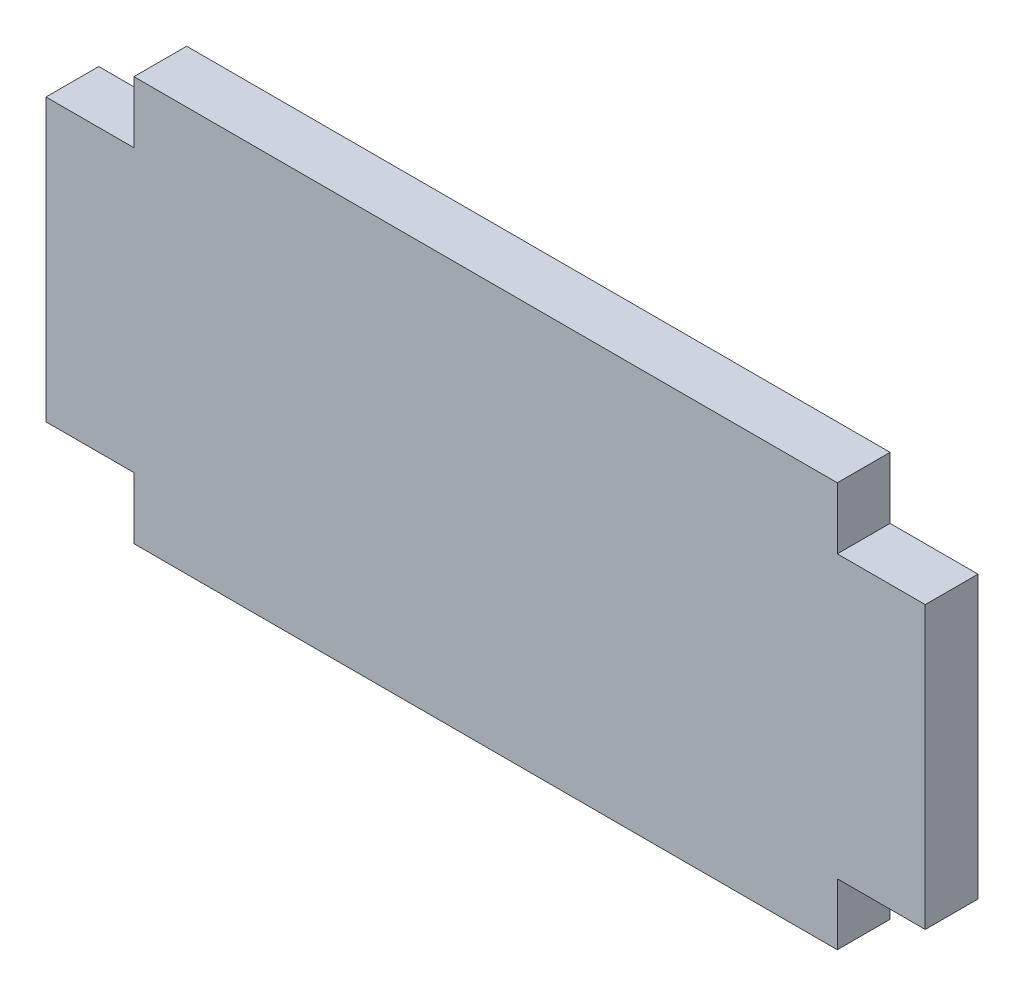
ISO-10303-21;
HEADER;
FILE_DESCRIPTION(('STEP AP214'),'2;1');
FILE_NAME('part.step','',(''),(''),'','','');
FILE_SCHEMA(('AUTOMOTIVE_DESIGN { 1 0 10303 214 1 1 1 1 }'));
ENDSEC;
DATA;
#1=APPLICATION_CONTEXT('core data for automotive mechanical design processes');
#2=APPLICATION_PROTOCOL_DEFINITION('international standard','automotive_design',2000,#1);
#3=PRODUCT_CONTEXT('',#1,'mechanical');
#4=PRODUCT('Part','Part','',(#3));
#5=PRODUCT_RELATED_PRODUCT_CATEGORY('part','',(#4));
#6=PRODUCT_DEFINITION_FORMATION('','',#4);
#7=PRODUCT_DEFINITION_CONTEXT('part definition',#1,'design');
#8=PRODUCT_DEFINITION('design','',#6,#7);
#9=PRODUCT_DEFINITION_SHAPE('','',#8);
#10=(LENGTH_UNIT() NAMED_UNIT(*) SI_UNIT(.MILLI.,.METRE.));
#11=(NAMED_UNIT(*) PLANE_ANGLE_UNIT() SI_UNIT($,.RADIAN.));
#12=(NAMED_UNIT(*) SI_UNIT($,.STERADIAN.) SOLID_ANGLE_UNIT());
#13=UNCERTAINTY_MEASURE_WITH_UNIT(LENGTH_MEASURE(1.E-05),#10,'distance_accuracy_value','');
#14=(GEOMETRIC_REPRESENTATION_CONTEXT(3) GLOBAL_UNCERTAINTY_ASSIGNED_CONTEXT((#13)) GLOBAL_UNIT_ASSIGNED_CONTEXT((#10,
#11,#12)) REPRESENTATION_CONTEXT('',''));
#15=CARTESIAN_POINT('',(0.,0.,0.));
#16=DIRECTION('',(0.,0.,1.));
#17=DIRECTION('',(1.,0.,0.));
#18=AXIS2_PLACEMENT_3D('',#15,#16,#17);
#19=CARTESIAN_POINT('',(-4.,-16.,6.));
#20=DIRECTION('',(0.,1.,0.));
#21=DIRECTION('',(0.,0.,1.));
#22=AXIS2_PLACEMENT_3D('',#19,#20,#21);
#23=PLANE('',#22);
#24=DIRECTION('',(1.,0.,0.));
#25=VECTOR('',#24,1.);
#26=CARTESIAN_POINT('',(-4.,-16.,0.));
#27=LINE('',#26,#25);
#28=CARTESIAN_POINT('',(-4.,-16.,0.));
#29=VERTEX_POINT('',#28);
#30=CARTESIAN_POINT('',(6.,-16.,0.));
#31=VERTEX_POINT('',#30);
#32=EDGE_CURVE('E153',#29,#31,#27,.T.);
#33=ORIENTED_EDGE('',*,*,#32,.T.);
#34=DIRECTION('',(0.,0.,-1.));
#35=VECTOR('',#34,1.);
#36=CARTESIAN_POINT('',(6.,-16.,6.));
#37=LINE('',#36,#35);
#38=CARTESIAN_POINT('',(6.,-16.,6.));
#39=VERTEX_POINT('',#38);
#40=EDGE_CURVE('E11',#39,#31,#37,.T.);
#41=ORIENTED_EDGE('',*,*,#40,.F.);
#42=DIRECTION('',(1.,0.,0.));
#43=VECTOR('',#42,1.);
#44=CARTESIAN_POINT('',(-4.,-16.,6.));
#45=LINE('',#44,#43);
#46=CARTESIAN_POINT('',(-4.,-16.,6.));
#47=VERTEX_POINT('',#46);
#48=EDGE_CURVE('E175',#47,#39,#45,.T.);
#49=ORIENTED_EDGE('',*,*,#48,.F.);
#50=DIRECTION('',(0.,0.,-1.));
#51=VECTOR('',#50,1.);
#52=CARTESIAN_POINT('',(-4.,-16.,6.));
#53=LINE('',#52,#51);
#54=EDGE_CURVE('E149',#47,#29,#53,.T.);
#55=ORIENTED_EDGE('',*,*,#54,.T.);
#56=EDGE_LOOP('',(#33,#41,#49,#55));
#57=FACE_BOUND('',#56,.T.);
#58=ADVANCED_FACE('F33',(#57),#23,.F.);
#59=CARTESIAN_POINT('',(6.,-16.,6.));
#60=DIRECTION('',(1.,0.,0.));
#61=DIRECTION('',(0.,1.,0.));
#62=AXIS2_PLACEMENT_3D('',#59,#60,#61);
#63=PLANE('',#62);
#64=DIRECTION('',(0.,-1.,0.));
#65=VECTOR('',#64,1.);
#66=CARTESIAN_POINT('',(6.,-16.,0.));
#67=LINE('',#66,#65);
#68=CARTESIAN_POINT('',(5.99999999999999,-23.,0.));
#69=VERTEX_POINT('',#68);
#70=EDGE_CURVE('E156',#31,#69,#67,.T.);
#71=ORIENTED_EDGE('',*,*,#70,.T.);
#72=DIRECTION('',(0.,0.,-1.));
#73=VECTOR('',#72,1.);
#74=CARTESIAN_POINT('',(5.99999999999999,-23.,6.));
#75=LINE('',#74,#73);
#76=CARTESIAN_POINT('',(5.99999999999999,-23.,6.));
#77=VERTEX_POINT('',#76);
#78=EDGE_CURVE('E41',#77,#69,#75,.T.);
#79=ORIENTED_EDGE('',*,*,#78,.F.);
#80=DIRECTION('',(0.,-1.,0.));
#81=VECTOR('',#80,1.);
#82=CARTESIAN_POINT('',(6.,-16.,6.));
#83=LINE('',#82,#81);
#84=EDGE_CURVE('E104',#39,#77,#83,.T.);
#85=ORIENTED_EDGE('',*,*,#84,.F.);
#86=ORIENTED_EDGE('',*,*,#40,.T.);
#87=EDGE_LOOP('',(#71,#79,#85,#86));
#88=FACE_BOUND('',#87,.T.);
#89=ADVANCED_FACE('F253',(#88),#63,.F.);
#90=CARTESIAN_POINT('',(5.99999999999999,-23.,6.));
#91=DIRECTION('',(0.,1.,0.));
#92=DIRECTION('',(0.,0.,1.));
#93=AXIS2_PLACEMENT_3D('',#90,#91,#92);
#94=PLANE('',#93);
#95=DIRECTION('',(1.,0.,0.));
#96=VECTOR('',#95,1.);
#97=CARTESIAN_POINT('',(5.99999999999999,-23.,0.));
#98=LINE('',#97,#96);
#99=CARTESIAN_POINT('',(86.,-23.,0.));
#100=VERTEX_POINT('',#99);
#101=EDGE_CURVE('E158',#69,#100,#98,.T.);
#102=ORIENTED_EDGE('',*,*,#101,.T.);
#103=DIRECTION('',(0.,0.,-1.));
#104=VECTOR('',#103,1.);
#105=CARTESIAN_POINT('',(86.,-23.,6.));
#106=LINE('',#105,#104);
#107=CARTESIAN_POINT('',(86.,-23.,6.));
#108=VERTEX_POINT('',#107);
#109=EDGE_CURVE('E194',#108,#100,#106,.T.);
#110=ORIENTED_EDGE('',*,*,#109,.F.);
#111=DIRECTION('',(1.,0.,0.));
#112=VECTOR('',#111,1.);
#113=CARTESIAN_POINT('',(5.99999999999999,-23.,6.));
#114=LINE('',#113,#112);
#115=EDGE_CURVE('E202',#77,#108,#114,.T.);
#116=ORIENTED_EDGE('',*,*,#115,.F.);
#117=ORIENTED_EDGE('',*,*,#78,.T.);
#118=EDGE_LOOP('',(#102,#110,#116,#117));
#119=FACE_BOUND('',#118,.T.);
#120=ADVANCED_FACE('F200',(#119),#94,.F.);
#121=CARTESIAN_POINT('',(86.,-16.,6.));
#122=DIRECTION('',(-1.,0.,0.));
#123=DIRECTION('',(0.,-1.,0.));
#124=AXIS2_PLACEMENT_3D('',#121,#122,#123);
#125=PLANE('',#124);
#126=DIRECTION('',(0.,1.,0.));
#127=VECTOR('',#126,1.);
#128=CARTESIAN_POINT('',(86.,-16.,0.));
#129=LINE('',#128,#127);
#130=CARTESIAN_POINT('',(86.,-16.,0.));
#131=VERTEX_POINT('',#130);
#132=EDGE_CURVE('E160',#100,#131,#129,.T.);
#133=ORIENTED_EDGE('',*,*,#132,.T.);
#134=DIRECTION('',(0.,0.,-1.));
#135=VECTOR('',#134,1.);
#136=CARTESIAN_POINT('',(86.,-16.,6.));
#137=LINE('',#136,#135);
#138=CARTESIAN_POINT('',(86.,-16.,6.));
#139=VERTEX_POINT('',#138);
#140=EDGE_CURVE('E191',#139,#131,#137,.T.);
#141=ORIENTED_EDGE('',*,*,#140,.F.);
#142=DIRECTION('',(0.,1.,0.));
#143=VECTOR('',#142,1.);
#144=CARTESIAN_POINT('',(86.,-16.,6.));
#145=LINE('',#144,#143);
#146=EDGE_CURVE('E220',#108,#139,#145,.T.);
#147=ORIENTED_EDGE('',*,*,#146,.F.);
#148=ORIENTED_EDGE('',*,*,#109,.T.);
#149=EDGE_LOOP('',(#133,#141,#147,#148));
#150=FACE_BOUND('',#149,.T.);
#151=ADVANCED_FACE('F211',(#150),#125,.F.);
#152=CARTESIAN_POINT('',(96.,-16.,6.));
#153=DIRECTION('',(0.,1.,0.));
#154=DIRECTION('',(0.,0.,1.));
#155=AXIS2_PLACEMENT_3D('',#152,#153,#154);
#156=PLANE('',#155);
#157=DIRECTION('',(1.,0.,0.));
#158=VECTOR('',#157,1.);
#159=CARTESIAN_POINT('',(96.,-16.,0.));
#160=LINE('',#159,#158);
#161=CARTESIAN_POINT('',(96.,-16.,0.));
#162=VERTEX_POINT('',#161);
#163=EDGE_CURVE('E162',#131,#162,#160,.T.);
#164=ORIENTED_EDGE('',*,*,#163,.T.);
#165=DIRECTION('',(0.,0.,-1.));
#166=VECTOR('',#165,1.);
#167=CARTESIAN_POINT('',(96.,-16.,6.));
#168=LINE('',#167,#166);
#169=CARTESIAN_POINT('',(96.,-16.,6.));
#170=VERTEX_POINT('',#169);
#171=EDGE_CURVE('E188',#170,#162,#168,.T.);
#172=ORIENTED_EDGE('',*,*,#171,.F.);
#173=DIRECTION('',(1.,0.,0.));
#174=VECTOR('',#173,1.);
#175=CARTESIAN_POINT('',(96.,-16.,6.));
#176=LINE('',#175,#174);
#177=EDGE_CURVE('E217',#139,#170,#176,.T.);
#178=ORIENTED_EDGE('',*,*,#177,.F.);
#179=ORIENTED_EDGE('',*,*,#140,.T.);
#180=EDGE_LOOP('',(#164,#172,#178,#179));
#181=FACE_BOUND('',#180,.T.);
#182=ADVANCED_FACE('F215',(#181),#156,.F.);
#183=CARTESIAN_POINT('',(96.,-16.,6.));
#184=DIRECTION('',(-1.,0.,0.));
#185=DIRECTION('',(0.,0.,1.));
#186=AXIS2_PLACEMENT_3D('',#183,#184,#185);
#187=PLANE('',#186);
#188=DIRECTION('',(0.,1.,0.));
#189=VECTOR('',#188,1.);
#190=CARTESIAN_POINT('',(96.,-16.,0.));
#191=LINE('',#190,#189);
#192=CARTESIAN_POINT('',(96.,16.,0.));
#193=VERTEX_POINT('',#192);
#194=EDGE_CURVE('E164',#162,#193,#191,.T.);
#195=ORIENTED_EDGE('',*,*,#194,.T.);
#196=DIRECTION('',(0.,0.,-1.));
#197=VECTOR('',#196,1.);
#198=CARTESIAN_POINT('',(96.,16.,6.));
#199=LINE('',#198,#197);
#200=CARTESIAN_POINT('',(96.,16.,6.));
#201=VERTEX_POINT('',#200);
#202=EDGE_CURVE('E185',#201,#193,#199,.T.);
#203=ORIENTED_EDGE('',*,*,#202,.F.);
#204=DIRECTION('',(0.,1.,0.));
#205=VECTOR('',#204,1.);
#206=CARTESIAN_POINT('',(96.,-16.,6.));
#207=LINE('',#206,#205);
#208=EDGE_CURVE('E219',#170,#201,#207,.T.);
#209=ORIENTED_EDGE('',*,*,#208,.F.);
#210=ORIENTED_EDGE('',*,*,#171,.T.);
#211=EDGE_LOOP('',(#195,#203,#209,#210));
#212=FACE_BOUND('',#211,.T.);
#213=ADVANCED_FACE('F266',(#212),#187,.F.);
#214=CARTESIAN_POINT('',(96.,16.,6.));
#215=DIRECTION('',(0.,-1.,0.));
#216=DIRECTION('',(0.,0.,-1.));
#217=AXIS2_PLACEMENT_3D('',#214,#215,#216);
#218=PLANE('',#217);
#219=DIRECTION('',(-1.,0.,0.));
#220=VECTOR('',#219,1.);
#221=CARTESIAN_POINT('',(96.,16.,0.));
#222=LINE('',#221,#220);
#223=CARTESIAN_POINT('',(86.,16.,0.));
#224=VERTEX_POINT('',#223);
#225=EDGE_CURVE('E166',#193,#224,#222,.T.);
#226=ORIENTED_EDGE('',*,*,#225,.T.);
#227=DIRECTION('',(0.,0.,-1.));
#228=VECTOR('',#227,1.);
#229=CARTESIAN_POINT('',(86.,16.,6.));
#230=LINE('',#229,#228);
#231=CARTESIAN_POINT('',(86.,16.,6.));
#232=VERTEX_POINT('',#231);
#233=EDGE_CURVE('E182',#232,#224,#230,.T.);
#234=ORIENTED_EDGE('',*,*,#233,.F.);
#235=DIRECTION('',(-1.,0.,0.));
#236=VECTOR('',#235,1.);
#237=CARTESIAN_POINT('',(96.,16.,6.));
#238=LINE('',#237,#236);
#239=EDGE_CURVE('E222',#201,#232,#238,.T.);
#240=ORIENTED_EDGE('',*,*,#239,.F.);
#241=ORIENTED_EDGE('',*,*,#202,.T.);
#242=EDGE_LOOP('',(#226,#234,#240,#241));
#243=FACE_BOUND('',#242,.T.);
#244=ADVANCED_FACE('F269',(#243),#218,.F.);
#245=CARTESIAN_POINT('',(86.,16.,6.));
#246=DIRECTION('',(-1.,0.,0.));
#247=DIRECTION('',(0.,-1.,0.));
#248=AXIS2_PLACEMENT_3D('',#245,#246,#247);
#249=PLANE('',#248);
#250=DIRECTION('',(0.,1.,0.));
#251=VECTOR('',#250,1.);
#252=CARTESIAN_POINT('',(86.,16.,0.));
#253=LINE('',#252,#251);
#254=CARTESIAN_POINT('',(86.,23.,0.));
#255=VERTEX_POINT('',#254);
#256=EDGE_CURVE('E168',#224,#255,#253,.T.);
#257=ORIENTED_EDGE('',*,*,#256,.T.);
#258=DIRECTION('',(0.,0.,-1.));
#259=VECTOR('',#258,1.);
#260=CARTESIAN_POINT('',(86.,23.,6.));
#261=LINE('',#260,#259);
#262=CARTESIAN_POINT('',(86.,23.,6.));
#263=VERTEX_POINT('',#262);
#264=EDGE_CURVE('E179',#263,#255,#261,.T.);
#265=ORIENTED_EDGE('',*,*,#264,.F.);
#266=DIRECTION('',(0.,1.,0.));
#267=VECTOR('',#266,1.);
#268=CARTESIAN_POINT('',(86.,16.,6.));
#269=LINE('',#268,#267);
#270=EDGE_CURVE('E228',#232,#263,#269,.T.);
#271=ORIENTED_EDGE('',*,*,#270,.F.);
#272=ORIENTED_EDGE('',*,*,#233,.T.);
#273=EDGE_LOOP('',(#257,#265,#271,#272));
#274=FACE_BOUND('',#273,.T.);
#275=ADVANCED_FACE('F234',(#274),#249,.F.);
#276=CARTESIAN_POINT('',(5.99999999999999,23.,6.));
#277=DIRECTION('',(0.,-1.,0.));
#278=DIRECTION('',(0.,0.,-1.));
#279=AXIS2_PLACEMENT_3D('',#276,#277,#278);
#280=PLANE('',#279);
#281=DIRECTION('',(-1.,0.,0.));
#282=VECTOR('',#281,1.);
#283=CARTESIAN_POINT('',(5.99999999999999,23.,0.));
#284=LINE('',#283,#282);
#285=CARTESIAN_POINT('',(5.99999999999999,23.,0.));
#286=VERTEX_POINT('',#285);
#287=EDGE_CURVE('E170',#255,#286,#284,.T.);
#288=ORIENTED_EDGE('',*,*,#287,.T.);
#289=DIRECTION('',(0.,0.,-1.));
#290=VECTOR('',#289,1.);
#291=CARTESIAN_POINT('',(5.99999999999999,23.,6.));
#292=LINE('',#291,#290);
#293=CARTESIAN_POINT('',(5.99999999999999,23.,6.));
#294=VERTEX_POINT('',#293);
#295=EDGE_CURVE('E144',#294,#286,#292,.T.);
#296=ORIENTED_EDGE('',*,*,#295,.F.);
#297=DIRECTION('',(-1.,0.,0.));
#298=VECTOR('',#297,1.);
#299=CARTESIAN_POINT('',(5.99999999999999,23.,6.));
#300=LINE('',#299,#298);
#301=EDGE_CURVE('E135',#263,#294,#300,.T.);
#302=ORIENTED_EDGE('',*,*,#301,.F.);
#303=ORIENTED_EDGE('',*,*,#264,.T.);
#304=EDGE_LOOP('',(#288,#296,#302,#303));
#305=FACE_BOUND('',#304,.T.);
#306=ADVANCED_FACE('F238',(#305),#280,.F.);
#307=CARTESIAN_POINT('',(6.,16.,6.));
#308=DIRECTION('',(1.,0.,0.));
#309=DIRECTION('',(0.,1.,0.));
#310=AXIS2_PLACEMENT_3D('',#307,#308,#309);
#311=PLANE('',#310);
#312=DIRECTION('',(0.,-1.,0.));
#313=VECTOR('',#312,1.);
#314=CARTESIAN_POINT('',(6.,16.,0.));
#315=LINE('',#314,#313);
#316=CARTESIAN_POINT('',(6.,16.,0.));
#317=VERTEX_POINT('',#316);
#318=EDGE_CURVE('E143',#286,#317,#315,.T.);
#319=ORIENTED_EDGE('',*,*,#318,.T.);
#320=DIRECTION('',(0.,0.,-1.));
#321=VECTOR('',#320,1.);
#322=CARTESIAN_POINT('',(6.,16.,6.));
#323=LINE('',#322,#321);
#324=CARTESIAN_POINT('',(6.,16.,6.));
#325=VERTEX_POINT('',#324);
#326=EDGE_CURVE('E140',#325,#317,#323,.T.);
#327=ORIENTED_EDGE('',*,*,#326,.F.);
#328=DIRECTION('',(0.,-1.,0.));
#329=VECTOR('',#328,1.);
#330=CARTESIAN_POINT('',(6.,16.,6.));
#331=LINE('',#330,#329);
#332=EDGE_CURVE('E129',#294,#325,#331,.T.);
#333=ORIENTED_EDGE('',*,*,#332,.F.);
#334=ORIENTED_EDGE('',*,*,#295,.T.);
#335=EDGE_LOOP('',(#319,#327,#333,#334));
#336=FACE_BOUND('',#335,.T.);
#337=ADVANCED_FACE('F141',(#336),#311,.F.);
#338=CARTESIAN_POINT('',(-4.,16.,6.));
#339=DIRECTION('',(0.,-1.,0.));
#340=DIRECTION('',(0.,0.,-1.));
#341=AXIS2_PLACEMENT_3D('',#338,#339,#340);
#342=PLANE('',#341);
#343=DIRECTION('',(-1.,0.,0.));
#344=VECTOR('',#343,1.);
#345=CARTESIAN_POINT('',(-4.,16.,0.));
#346=LINE('',#345,#344);
#347=CARTESIAN_POINT('',(-4.,16.,0.));
#348=VERTEX_POINT('',#347);
#349=EDGE_CURVE('E90',#317,#348,#346,.T.);
#350=ORIENTED_EDGE('',*,*,#349,.T.);
#351=DIRECTION('',(0.,0.,-1.));
#352=VECTOR('',#351,1.);
#353=CARTESIAN_POINT('',(-4.,16.,6.));
#354=LINE('',#353,#352);
#355=CARTESIAN_POINT('',(-4.,16.,6.));
#356=VERTEX_POINT('',#355);
#357=EDGE_CURVE('E145',#356,#348,#354,.T.);
#358=ORIENTED_EDGE('',*,*,#357,.F.);
#359=DIRECTION('',(-1.,0.,0.));
#360=VECTOR('',#359,1.);
#361=CARTESIAN_POINT('',(-4.,16.,6.));
#362=LINE('',#361,#360);
#363=EDGE_CURVE('E133',#325,#356,#362,.T.);
#364=ORIENTED_EDGE('',*,*,#363,.F.);
#365=ORIENTED_EDGE('',*,*,#326,.T.);
#366=EDGE_LOOP('',(#350,#358,#364,#365));
#367=FACE_BOUND('',#366,.T.);
#368=ADVANCED_FACE('F147',(#367),#342,.F.);
#369=CARTESIAN_POINT('',(-4.,-16.,6.));
#370=DIRECTION('',(1.,0.,0.));
#371=DIRECTION('',(0.,0.,-1.));
#372=AXIS2_PLACEMENT_3D('',#369,#370,#371);
#373=PLANE('',#372);
#374=DIRECTION('',(0.,-1.,0.));
#375=VECTOR('',#374,1.);
#376=CARTESIAN_POINT('',(-4.,-16.,0.));
#377=LINE('',#376,#375);
#378=EDGE_CURVE('E96',#348,#29,#377,.T.);
#379=ORIENTED_EDGE('',*,*,#378,.T.);
#380=ORIENTED_EDGE('',*,*,#54,.F.);
#381=DIRECTION('',(0.,-1.,0.));
#382=VECTOR('',#381,1.);
#383=CARTESIAN_POINT('',(-4.,-16.,6.));
#384=LINE('',#383,#382);
#385=EDGE_CURVE('E49',#356,#47,#384,.T.);
#386=ORIENTED_EDGE('',*,*,#385,.F.);
#387=ORIENTED_EDGE('',*,*,#357,.T.);
#388=EDGE_LOOP('',(#379,#380,#386,#387));
#389=FACE_BOUND('',#388,.T.);
#390=ADVANCED_FACE('F242',(#389),#373,.F.);
#391=CARTESIAN_POINT('',(0.,0.,6.));
#392=DIRECTION('',(0.,0.,-1.));
#393=DIRECTION('',(-1.,0.,0.));
#394=AXIS2_PLACEMENT_3D('',#391,#392,#393);
#395=PLANE('',#394);
#396=ORIENTED_EDGE('',*,*,#48,.T.);
#397=ORIENTED_EDGE('',*,*,#84,.T.);
#398=ORIENTED_EDGE('',*,*,#115,.T.);
#399=ORIENTED_EDGE('',*,*,#146,.T.);
#400=ORIENTED_EDGE('',*,*,#177,.T.);
#401=ORIENTED_EDGE('',*,*,#208,.T.);
#402=ORIENTED_EDGE('',*,*,#239,.T.);
#403=ORIENTED_EDGE('',*,*,#270,.T.);
#404=ORIENTED_EDGE('',*,*,#301,.T.);
#405=ORIENTED_EDGE('',*,*,#332,.T.);
#406=ORIENTED_EDGE('',*,*,#363,.T.);
#407=ORIENTED_EDGE('',*,*,#385,.T.);
#408=EDGE_LOOP('',(#396,#397,#398,#399,#400,#401,#402,#403,#404,#405,#406,#407));
#409=FACE_BOUND('',#408,.T.);
#410=ADVANCED_FACE('F131',(#409),#395,.F.);
#411=CARTESIAN_POINT('',(0.,0.,0.));
#412=DIRECTION('',(0.,0.,-1.));
#413=DIRECTION('',(-1.,0.,0.));
#414=AXIS2_PLACEMENT_3D('',#411,#412,#413);
#415=PLANE('',#414);
#416=ORIENTED_EDGE('',*,*,#32,.F.);
#417=ORIENTED_EDGE('',*,*,#378,.F.);
#418=ORIENTED_EDGE('',*,*,#349,.F.);
#419=ORIENTED_EDGE('',*,*,#318,.F.);
#420=ORIENTED_EDGE('',*,*,#287,.F.);
#421=ORIENTED_EDGE('',*,*,#256,.F.);
#422=ORIENTED_EDGE('',*,*,#225,.F.);
#423=ORIENTED_EDGE('',*,*,#194,.F.);
#424=ORIENTED_EDGE('',*,*,#163,.F.);
#425=ORIENTED_EDGE('',*,*,#132,.F.);
#426=ORIENTED_EDGE('',*,*,#101,.F.);
#427=ORIENTED_EDGE('',*,*,#70,.F.);
#428=EDGE_LOOP('',(#416,#417,#418,#419,#420,#421,#422,#423,#424,#425,#426,#427));
#429=FACE_BOUND('',#428,.T.);
#430=ADVANCED_FACE('F206',(#429),#415,.T.);
#431=CLOSED_SHELL('',(#58,#89,#120,#151,#182,#213,#244,#275,#306,#337,#368,#390,#410,#430));
#432=MANIFOLD_SOLID_BREP('B2',#431);
#433=ADVANCED_BREP_SHAPE_REPRESENTATION('',(#18,#432),#14);
#434=SHAPE_DEFINITION_REPRESENTATION(#9,#433);
ENDSEC;
END-ISO-10303-21;
